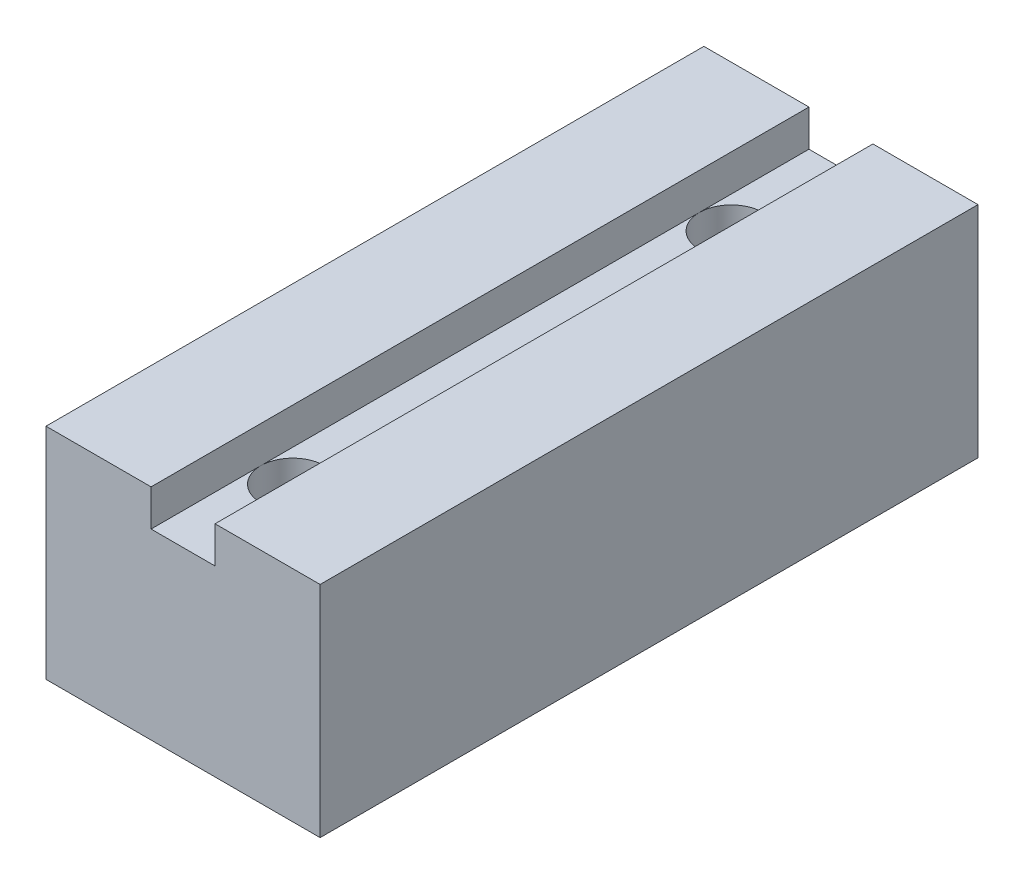
ISO-10303-21;
HEADER;
FILE_DESCRIPTION(('STEP AP214'),'2;1');
FILE_NAME('part.step','',(''),(''),'','','');
FILE_SCHEMA(('AUTOMOTIVE_DESIGN { 1 0 10303 214 1 1 1 1 }'));
ENDSEC;
DATA;
#1=APPLICATION_CONTEXT('core data for automotive mechanical design processes');
#2=APPLICATION_PROTOCOL_DEFINITION('international standard','automotive_design',2000,#1);
#3=PRODUCT_CONTEXT('',#1,'mechanical');
#4=PRODUCT('Part','Part','',(#3));
#5=PRODUCT_RELATED_PRODUCT_CATEGORY('part','',(#4));
#6=PRODUCT_DEFINITION_FORMATION('','',#4);
#7=PRODUCT_DEFINITION_CONTEXT('part definition',#1,'design');
#8=PRODUCT_DEFINITION('design','',#6,#7);
#9=PRODUCT_DEFINITION_SHAPE('','',#8);
#10=(LENGTH_UNIT() NAMED_UNIT(*) SI_UNIT(.MILLI.,.METRE.));
#11=(NAMED_UNIT(*) PLANE_ANGLE_UNIT() SI_UNIT($,.RADIAN.));
#12=(NAMED_UNIT(*) SI_UNIT($,.STERADIAN.) SOLID_ANGLE_UNIT());
#13=UNCERTAINTY_MEASURE_WITH_UNIT(LENGTH_MEASURE(1.E-05),#10,'distance_accuracy_value','');
#14=(GEOMETRIC_REPRESENTATION_CONTEXT(3) GLOBAL_UNCERTAINTY_ASSIGNED_CONTEXT((#13)) GLOBAL_UNIT_ASSIGNED_CONTEXT((#10,
#11,#12)) REPRESENTATION_CONTEXT('',''));
#15=CARTESIAN_POINT('',(0.,0.,0.));
#16=DIRECTION('',(0.,0.,1.));
#17=DIRECTION('',(1.,0.,0.));
#18=AXIS2_PLACEMENT_3D('',#15,#16,#17);
#19=CARTESIAN_POINT('',(0.,12.,0.));
#20=DIRECTION('',(0.,-1.,0.));
#21=DIRECTION('',(0.,0.,-1.));
#22=AXIS2_PLACEMENT_3D('',#19,#20,#21);
#23=PLANE('',#22);
#24=DIRECTION('',(1.,0.,0.));
#25=VECTOR('',#24,1.);
#26=CARTESIAN_POINT('',(0.,12.,0.));
#27=LINE('',#26,#25);
#28=CARTESIAN_POINT('',(0.,12.,0.));
#29=VERTEX_POINT('',#28);
#30=CARTESIAN_POINT('',(5.75,12.,0.));
#31=VERTEX_POINT('',#30);
#32=EDGE_CURVE('E165',#29,#31,#27,.T.);
#33=ORIENTED_EDGE('',*,*,#32,.T.);
#34=DIRECTION('',(0.,0.,1.));
#35=VECTOR('',#34,1.);
#36=CARTESIAN_POINT('',(5.75,12.,0.));
#37=LINE('',#36,#35);
#38=CARTESIAN_POINT('',(5.75000000000001,12.,-36.));
#39=VERTEX_POINT('',#38);
#40=EDGE_CURVE('E128',#39,#31,#37,.T.);
#41=ORIENTED_EDGE('',*,*,#40,.F.);
#42=DIRECTION('',(-1.,0.,0.));
#43=VECTOR('',#42,1.);
#44=CARTESIAN_POINT('',(0.,12.,-36.));
#45=LINE('',#44,#43);
#46=CARTESIAN_POINT('',(0.,12.,-36.));
#47=VERTEX_POINT('',#46);
#48=EDGE_CURVE('E169',#39,#47,#45,.T.);
#49=ORIENTED_EDGE('',*,*,#48,.T.);
#50=DIRECTION('',(0.,0.,1.));
#51=VECTOR('',#50,1.);
#52=CARTESIAN_POINT('',(0.,12.,0.));
#53=LINE('',#52,#51);
#54=EDGE_CURVE('E160',#47,#29,#53,.T.);
#55=ORIENTED_EDGE('',*,*,#54,.T.);
#56=EDGE_LOOP('',(#33,#41,#49,#55));
#57=FACE_BOUND('',#56,.T.);
#58=ADVANCED_FACE('F33',(#57),#23,.F.);
#59=CARTESIAN_POINT('',(0.,12.,0.));
#60=DIRECTION('',(1.,0.,0.));
#61=DIRECTION('',(0.,0.,-1.));
#62=AXIS2_PLACEMENT_3D('',#59,#60,#61);
#63=PLANE('',#62);
#64=DIRECTION('',(0.,0.,1.));
#65=VECTOR('',#64,1.);
#66=CARTESIAN_POINT('',(0.,0.,0.));
#67=LINE('',#66,#65);
#68=CARTESIAN_POINT('',(0.,0.,-36.));
#69=VERTEX_POINT('',#68);
#70=CARTESIAN_POINT('',(0.,0.,0.));
#71=VERTEX_POINT('',#70);
#72=EDGE_CURVE('E156',#69,#71,#67,.T.);
#73=ORIENTED_EDGE('',*,*,#72,.T.);
#74=DIRECTION('',(0.,-1.,0.));
#75=VECTOR('',#74,1.);
#76=CARTESIAN_POINT('',(0.,12.,0.));
#77=LINE('',#76,#75);
#78=EDGE_CURVE('E188',#29,#71,#77,.T.);
#79=ORIENTED_EDGE('',*,*,#78,.F.);
#80=ORIENTED_EDGE('',*,*,#54,.F.);
#81=DIRECTION('',(0.,-1.,0.));
#82=VECTOR('',#81,1.);
#83=CARTESIAN_POINT('',(0.,12.,-36.));
#84=LINE('',#83,#82);
#85=EDGE_CURVE('E173',#47,#69,#84,.T.);
#86=ORIENTED_EDGE('',*,*,#85,.T.);
#87=EDGE_LOOP('',(#73,#79,#80,#86));
#88=FACE_BOUND('',#87,.T.);
#89=ADVANCED_FACE('F35',(#88),#63,.F.);
#90=CARTESIAN_POINT('',(0.,12.,0.));
#91=DIRECTION('',(0.,0.,-1.));
#92=DIRECTION('',(-1.,0.,0.));
#93=AXIS2_PLACEMENT_3D('',#90,#91,#92);
#94=PLANE('',#93);
#95=DIRECTION('',(1.,0.,0.));
#96=VECTOR('',#95,1.);
#97=CARTESIAN_POINT('',(5.75,10.,0.));
#98=LINE('',#97,#96);
#99=CARTESIAN_POINT('',(5.75,10.,0.));
#100=VERTEX_POINT('',#99);
#101=CARTESIAN_POINT('',(9.25000000000001,10.,0.));
#102=VERTEX_POINT('',#101);
#103=EDGE_CURVE('E116',#100,#102,#98,.T.);
#104=ORIENTED_EDGE('',*,*,#103,.F.);
#105=DIRECTION('',(0.,1.,0.));
#106=VECTOR('',#105,1.);
#107=CARTESIAN_POINT('',(5.75,10.,0.));
#108=LINE('',#107,#106);
#109=EDGE_CURVE('E125',#100,#31,#108,.T.);
#110=ORIENTED_EDGE('',*,*,#109,.T.);
#111=ORIENTED_EDGE('',*,*,#32,.F.);
#112=ORIENTED_EDGE('',*,*,#78,.T.);
#113=DIRECTION('',(1.,0.,0.));
#114=VECTOR('',#113,1.);
#115=CARTESIAN_POINT('',(0.,0.,0.));
#116=LINE('',#115,#114);
#117=CARTESIAN_POINT('',(15.,0.,0.));
#118=VERTEX_POINT('',#117);
#119=EDGE_CURVE('E176',#71,#118,#116,.T.);
#120=ORIENTED_EDGE('',*,*,#119,.T.);
#121=DIRECTION('',(0.,-1.,0.));
#122=VECTOR('',#121,1.);
#123=CARTESIAN_POINT('',(15.,12.,0.));
#124=LINE('',#123,#122);
#125=CARTESIAN_POINT('',(15.,12.,0.));
#126=VERTEX_POINT('',#125);
#127=EDGE_CURVE('E186',#126,#118,#124,.T.);
#128=ORIENTED_EDGE('',*,*,#127,.F.);
#129=CARTESIAN_POINT('',(9.25,12.,0.));
#130=VERTEX_POINT('',#129);
#131=EDGE_CURVE('E163',#130,#126,#27,.T.);
#132=ORIENTED_EDGE('',*,*,#131,.F.);
#133=DIRECTION('',(0.,1.,0.));
#134=VECTOR('',#133,1.);
#135=CARTESIAN_POINT('',(9.25000000000001,10.,0.));
#136=LINE('',#135,#134);
#137=EDGE_CURVE('E48',#102,#130,#136,.T.);
#138=ORIENTED_EDGE('',*,*,#137,.F.);
#139=EDGE_LOOP('',(#104,#110,#111,#112,#120,#128,#132,#138));
#140=FACE_BOUND('',#139,.T.);
#141=ADVANCED_FACE('F133',(#140),#94,.F.);
#142=CARTESIAN_POINT('',(15.,12.,0.));
#143=DIRECTION('',(-1.,0.,0.));
#144=DIRECTION('',(0.,0.,1.));
#145=AXIS2_PLACEMENT_3D('',#142,#143,#144);
#146=PLANE('',#145);
#147=DIRECTION('',(0.,0.,-1.));
#148=VECTOR('',#147,1.);
#149=CARTESIAN_POINT('',(15.,0.,0.));
#150=LINE('',#149,#148);
#151=CARTESIAN_POINT('',(15.,0.,-36.));
#152=VERTEX_POINT('',#151);
#153=EDGE_CURVE('E178',#118,#152,#150,.T.);
#154=ORIENTED_EDGE('',*,*,#153,.T.);
#155=DIRECTION('',(0.,-1.,0.));
#156=VECTOR('',#155,1.);
#157=CARTESIAN_POINT('',(15.,12.,-36.));
#158=LINE('',#157,#156);
#159=CARTESIAN_POINT('',(15.,12.,-36.));
#160=VERTEX_POINT('',#159);
#161=EDGE_CURVE('E183',#160,#152,#158,.T.);
#162=ORIENTED_EDGE('',*,*,#161,.F.);
#163=DIRECTION('',(0.,0.,-1.));
#164=VECTOR('',#163,1.);
#165=CARTESIAN_POINT('',(15.,12.,0.));
#166=LINE('',#165,#164);
#167=EDGE_CURVE('E167',#126,#160,#166,.T.);
#168=ORIENTED_EDGE('',*,*,#167,.F.);
#169=ORIENTED_EDGE('',*,*,#127,.T.);
#170=EDGE_LOOP('',(#154,#162,#168,#169));
#171=FACE_BOUND('',#170,.T.);
#172=ADVANCED_FACE('F231',(#171),#146,.F.);
#173=CARTESIAN_POINT('',(0.,12.,-36.));
#174=DIRECTION('',(0.,0.,1.));
#175=DIRECTION('',(1.,0.,0.));
#176=AXIS2_PLACEMENT_3D('',#173,#174,#175);
#177=PLANE('',#176);
#178=ORIENTED_EDGE('',*,*,#48,.F.);
#179=DIRECTION('',(0.,1.,0.));
#180=VECTOR('',#179,1.);
#181=CARTESIAN_POINT('',(5.75000000000001,10.,-36.));
#182=LINE('',#181,#180);
#183=CARTESIAN_POINT('',(5.75000000000001,10.,-36.));
#184=VERTEX_POINT('',#183);
#185=EDGE_CURVE('E145',#184,#39,#182,.T.);
#186=ORIENTED_EDGE('',*,*,#185,.F.);
#187=DIRECTION('',(-1.,0.,0.));
#188=VECTOR('',#187,1.);
#189=CARTESIAN_POINT('',(5.75000000000001,10.,-36.));
#190=LINE('',#189,#188);
#191=CARTESIAN_POINT('',(9.24999999999999,10.,-36.));
#192=VERTEX_POINT('',#191);
#193=EDGE_CURVE('E131',#192,#184,#190,.T.);
#194=ORIENTED_EDGE('',*,*,#193,.F.);
#195=DIRECTION('',(0.,1.,0.));
#196=VECTOR('',#195,1.);
#197=CARTESIAN_POINT('',(9.24999999999999,10.,-36.));
#198=LINE('',#197,#196);
#199=CARTESIAN_POINT('',(9.24999999999999,12.,-36.));
#200=VERTEX_POINT('',#199);
#201=EDGE_CURVE('E148',#192,#200,#198,.T.);
#202=ORIENTED_EDGE('',*,*,#201,.T.);
#203=EDGE_CURVE('E170',#160,#200,#45,.T.);
#204=ORIENTED_EDGE('',*,*,#203,.F.);
#205=ORIENTED_EDGE('',*,*,#161,.T.);
#206=DIRECTION('',(-1.,0.,0.));
#207=VECTOR('',#206,1.);
#208=CARTESIAN_POINT('',(0.,0.,-36.));
#209=LINE('',#208,#207);
#210=EDGE_CURVE('E164',#152,#69,#209,.T.);
#211=ORIENTED_EDGE('',*,*,#210,.T.);
#212=ORIENTED_EDGE('',*,*,#85,.F.);
#213=EDGE_LOOP('',(#178,#186,#194,#202,#204,#205,#211,#212));
#214=FACE_BOUND('',#213,.T.);
#215=ADVANCED_FACE('F225',(#214),#177,.F.);
#216=ORIENTED_EDGE('',*,*,#203,.T.);
#217=DIRECTION('',(0.,0.,-1.));
#218=VECTOR('',#217,1.);
#219=CARTESIAN_POINT('',(9.25000000000001,12.,0.));
#220=LINE('',#219,#218);
#221=EDGE_CURVE('E121',#130,#200,#220,.T.);
#222=ORIENTED_EDGE('',*,*,#221,.F.);
#223=ORIENTED_EDGE('',*,*,#131,.T.);
#224=ORIENTED_EDGE('',*,*,#167,.T.);
#225=EDGE_LOOP('',(#216,#222,#223,#224));
#226=FACE_BOUND('',#225,.T.);
#227=ADVANCED_FACE('F214',(#226),#23,.F.);
#228=CARTESIAN_POINT('',(0.,0.,0.));
#229=DIRECTION('',(0.,-1.,0.));
#230=DIRECTION('',(0.,0.,-1.));
#231=AXIS2_PLACEMENT_3D('',#228,#229,#230);
#232=PLANE('',#231);
#233=CARTESIAN_POINT('',(7.5,0.,-30.));
#234=DIRECTION('',(0.,1.,0.));
#235=DIRECTION('',(0.,0.,1.));
#236=AXIS2_PLACEMENT_3D('',#233,#234,#235);
#237=CIRCLE('',#236,1.75);
#238=CARTESIAN_POINT('',(7.5,0.,-28.25));
#239=VERTEX_POINT('',#238);
#240=EDGE_CURVE('E153',#239,#239,#237,.T.);
#241=ORIENTED_EDGE('',*,*,#240,.T.);
#242=EDGE_LOOP('',(#241));
#243=FACE_BOUND('',#242,.T.);
#244=CARTESIAN_POINT('',(7.5,0.,-6.));
#245=DIRECTION('',(0.,1.,0.));
#246=DIRECTION('',(0.,0.,1.));
#247=AXIS2_PLACEMENT_3D('',#244,#245,#246);
#248=CIRCLE('',#247,1.75);
#249=CARTESIAN_POINT('',(7.5,0.,-4.25));
#250=VERTEX_POINT('',#249);
#251=EDGE_CURVE('E157',#250,#250,#248,.T.);
#252=ORIENTED_EDGE('',*,*,#251,.T.);
#253=EDGE_LOOP('',(#252));
#254=FACE_BOUND('',#253,.T.);
#255=ORIENTED_EDGE('',*,*,#72,.F.);
#256=ORIENTED_EDGE('',*,*,#210,.F.);
#257=ORIENTED_EDGE('',*,*,#153,.F.);
#258=ORIENTED_EDGE('',*,*,#119,.F.);
#259=EDGE_LOOP('',(#255,#256,#257,#258));
#260=FACE_BOUND('',#259,.T.);
#261=ADVANCED_FACE('F208',(#243,#254,#260),#232,.T.);
#262=CARTESIAN_POINT('',(7.5,0.,-6.));
#263=DIRECTION('',(0.,1.,0.));
#264=DIRECTION('',(0.,0.,1.));
#265=AXIS2_PLACEMENT_3D('',#262,#263,#264);
#266=CYLINDRICAL_SURFACE('',#265,1.75);
#267=CARTESIAN_POINT('',(7.5,10.,-6.));
#268=DIRECTION('',(0.,-1.,0.));
#269=DIRECTION('',(0.,0.,-1.));
#270=AXIS2_PLACEMENT_3D('',#267,#268,#269);
#271=CIRCLE('',#270,1.75);
#272=CARTESIAN_POINT('',(9.25,10.,-6.));
#273=VERTEX_POINT('',#272);
#274=CARTESIAN_POINT('',(5.75,10.,-6.));
#275=VERTEX_POINT('',#274);
#276=EDGE_CURVE('E147',#273,#275,#271,.F.);
#277=ORIENTED_EDGE('',*,*,#276,.T.);
#278=EDGE_CURVE('E118',#275,#273,#271,.F.);
#279=ORIENTED_EDGE('',*,*,#278,.T.);
#280=EDGE_LOOP('',(#277,#279));
#281=FACE_BOUND('',#280,.T.);
#282=ORIENTED_EDGE('',*,*,#251,.F.);
#283=EDGE_LOOP('',(#282));
#284=FACE_BOUND('',#283,.T.);
#285=ADVANCED_FACE('F205',(#281,#284),#266,.F.);
#286=CARTESIAN_POINT('',(7.5,0.,-30.));
#287=DIRECTION('',(0.,1.,0.));
#288=DIRECTION('',(0.,0.,1.));
#289=AXIS2_PLACEMENT_3D('',#286,#287,#288);
#290=CYLINDRICAL_SURFACE('',#289,1.75);
#291=CARTESIAN_POINT('',(7.5,10.,-30.));
#292=DIRECTION('',(0.,-1.,0.));
#293=DIRECTION('',(0.,0.,-1.));
#294=AXIS2_PLACEMENT_3D('',#291,#292,#293);
#295=CIRCLE('',#294,1.75);
#296=CARTESIAN_POINT('',(9.24999999999999,10.,-30.));
#297=VERTEX_POINT('',#296);
#298=CARTESIAN_POINT('',(5.75,10.,-30.));
#299=VERTEX_POINT('',#298);
#300=EDGE_CURVE('E37',#297,#299,#295,.F.);
#301=ORIENTED_EDGE('',*,*,#300,.T.);
#302=EDGE_CURVE('E11',#299,#297,#295,.F.);
#303=ORIENTED_EDGE('',*,*,#302,.T.);
#304=EDGE_LOOP('',(#301,#303));
#305=FACE_BOUND('',#304,.T.);
#306=ORIENTED_EDGE('',*,*,#240,.F.);
#307=EDGE_LOOP('',(#306));
#308=FACE_BOUND('',#307,.T.);
#309=ADVANCED_FACE('F193',(#305,#308),#290,.F.);
#310=CARTESIAN_POINT('',(5.75,10.,0.));
#311=DIRECTION('',(-1.,0.,0.));
#312=DIRECTION('',(0.,0.,1.));
#313=AXIS2_PLACEMENT_3D('',#310,#311,#312);
#314=PLANE('',#313);
#315=ORIENTED_EDGE('',*,*,#40,.T.);
#316=ORIENTED_EDGE('',*,*,#109,.F.);
#317=DIRECTION('',(0.,0.,1.));
#318=VECTOR('',#317,1.);
#319=CARTESIAN_POINT('',(5.75,10.,0.));
#320=LINE('',#319,#318);
#321=EDGE_CURVE('E111',#275,#100,#320,.T.);
#322=ORIENTED_EDGE('',*,*,#321,.F.);
#323=EDGE_CURVE('E56',#299,#275,#320,.T.);
#324=ORIENTED_EDGE('',*,*,#323,.F.);
#325=EDGE_CURVE('E123',#184,#299,#320,.T.);
#326=ORIENTED_EDGE('',*,*,#325,.F.);
#327=ORIENTED_EDGE('',*,*,#185,.T.);
#328=EDGE_LOOP('',(#315,#316,#322,#324,#326,#327));
#329=FACE_BOUND('',#328,.T.);
#330=ADVANCED_FACE('F126',(#329),#314,.F.);
#331=CARTESIAN_POINT('',(9.25000000000001,10.,0.));
#332=DIRECTION('',(1.,0.,0.));
#333=DIRECTION('',(0.,0.,-1.));
#334=AXIS2_PLACEMENT_3D('',#331,#332,#333);
#335=PLANE('',#334);
#336=ORIENTED_EDGE('',*,*,#221,.T.);
#337=ORIENTED_EDGE('',*,*,#201,.F.);
#338=DIRECTION('',(0.,0.,-1.));
#339=VECTOR('',#338,1.);
#340=CARTESIAN_POINT('',(9.25000000000001,10.,0.));
#341=LINE('',#340,#339);
#342=EDGE_CURVE('E135',#297,#192,#341,.T.);
#343=ORIENTED_EDGE('',*,*,#342,.F.);
#344=EDGE_CURVE('E137',#273,#297,#341,.T.);
#345=ORIENTED_EDGE('',*,*,#344,.F.);
#346=EDGE_CURVE('E139',#102,#273,#341,.T.);
#347=ORIENTED_EDGE('',*,*,#346,.F.);
#348=ORIENTED_EDGE('',*,*,#137,.T.);
#349=EDGE_LOOP('',(#336,#337,#343,#345,#347,#348));
#350=FACE_BOUND('',#349,.T.);
#351=ADVANCED_FACE('F201',(#350),#335,.F.);
#352=CARTESIAN_POINT('',(0.,10.,0.));
#353=DIRECTION('',(0.,-1.,0.));
#354=DIRECTION('',(0.,0.,-1.));
#355=AXIS2_PLACEMENT_3D('',#352,#353,#354);
#356=PLANE('',#355);
#357=ORIENTED_EDGE('',*,*,#321,.T.);
#358=ORIENTED_EDGE('',*,*,#103,.T.);
#359=ORIENTED_EDGE('',*,*,#346,.T.);
#360=ORIENTED_EDGE('',*,*,#278,.F.);
#361=EDGE_LOOP('',(#357,#358,#359,#360));
#362=FACE_BOUND('',#361,.T.);
#363=ADVANCED_FACE('F113',(#362),#356,.F.);
#364=ORIENTED_EDGE('',*,*,#344,.T.);
#365=ORIENTED_EDGE('',*,*,#302,.F.);
#366=ORIENTED_EDGE('',*,*,#323,.T.);
#367=ORIENTED_EDGE('',*,*,#276,.F.);
#368=EDGE_LOOP('',(#364,#365,#366,#367));
#369=FACE_BOUND('',#368,.T.);
#370=ADVANCED_FACE('F203',(#369),#356,.F.);
#371=ORIENTED_EDGE('',*,*,#342,.T.);
#372=ORIENTED_EDGE('',*,*,#193,.T.);
#373=ORIENTED_EDGE('',*,*,#325,.T.);
#374=ORIENTED_EDGE('',*,*,#300,.F.);
#375=EDGE_LOOP('',(#371,#372,#373,#374));
#376=FACE_BOUND('',#375,.T.);
#377=ADVANCED_FACE('F197',(#376),#356,.F.);
#378=CLOSED_SHELL('',(#58,#89,#141,#172,#215,#227,#261,#285,#309,#330,#351,#363,#370,#377));
#379=MANIFOLD_SOLID_BREP('B2',#378);
#380=ADVANCED_BREP_SHAPE_REPRESENTATION('',(#18,#379),#14);
#381=SHAPE_DEFINITION_REPRESENTATION(#9,#380);
ENDSEC;
END-ISO-10303-21;
